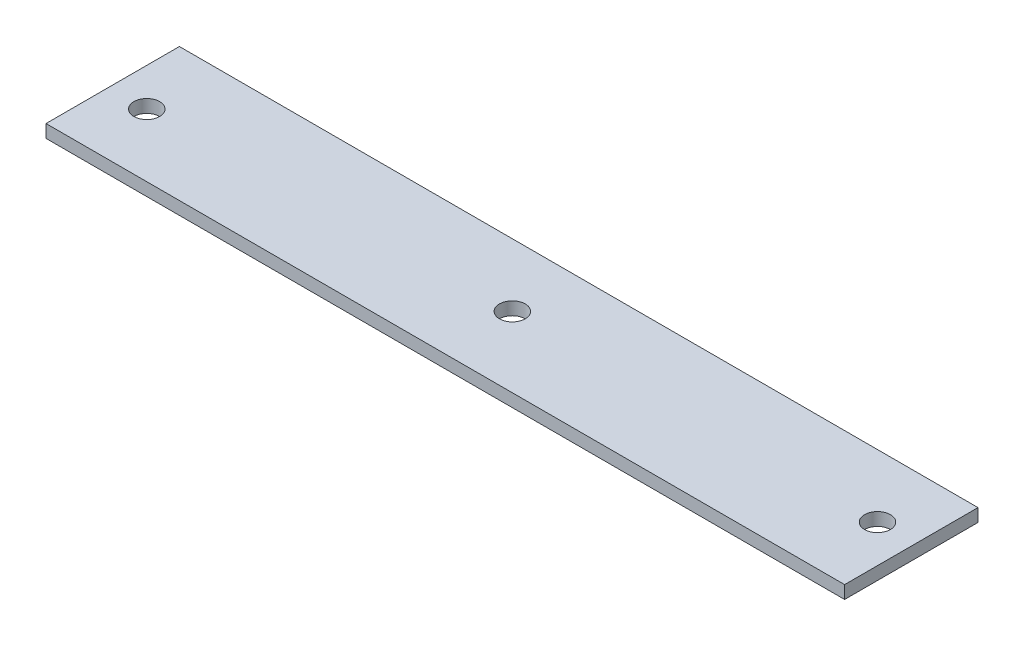
ISO-10303-21;
HEADER;
FILE_DESCRIPTION(('STEP AP214'),'2;1');
FILE_NAME('part.step','',(''),(''),'','','');
FILE_SCHEMA(('AUTOMOTIVE_DESIGN { 1 0 10303 214 1 1 1 1 }'));
ENDSEC;
DATA;
#1=APPLICATION_CONTEXT('core data for automotive mechanical design processes');
#2=APPLICATION_PROTOCOL_DEFINITION('international standard','automotive_design',2000,#1);
#3=PRODUCT_CONTEXT('',#1,'mechanical');
#4=PRODUCT('Part','Part','',(#3));
#5=PRODUCT_RELATED_PRODUCT_CATEGORY('part','',(#4));
#6=PRODUCT_DEFINITION_FORMATION('','',#4);
#7=PRODUCT_DEFINITION_CONTEXT('part definition',#1,'design');
#8=PRODUCT_DEFINITION('design','',#6,#7);
#9=PRODUCT_DEFINITION_SHAPE('','',#8);
#10=(LENGTH_UNIT() NAMED_UNIT(*) SI_UNIT(.MILLI.,.METRE.));
#11=(NAMED_UNIT(*) PLANE_ANGLE_UNIT() SI_UNIT($,.RADIAN.));
#12=(NAMED_UNIT(*) SI_UNIT($,.STERADIAN.) SOLID_ANGLE_UNIT());
#13=UNCERTAINTY_MEASURE_WITH_UNIT(LENGTH_MEASURE(1.E-05),#10,'distance_accuracy_value','');
#14=(GEOMETRIC_REPRESENTATION_CONTEXT(3) GLOBAL_UNCERTAINTY_ASSIGNED_CONTEXT((#13)) GLOBAL_UNIT_ASSIGNED_CONTEXT((#10,
#11,#12)) REPRESENTATION_CONTEXT('',''));
#15=CARTESIAN_POINT('',(0.,0.,0.));
#16=DIRECTION('',(0.,0.,1.));
#17=DIRECTION('',(1.,0.,0.));
#18=AXIS2_PLACEMENT_3D('',#15,#16,#17);
#19=CARTESIAN_POINT('',(0.,1.5,0.));
#20=DIRECTION('',(0.,1.,0.));
#21=DIRECTION('',(0.,0.,1.));
#22=AXIS2_PLACEMENT_3D('',#19,#20,#21);
#23=PLANE('',#22);
#24=CARTESIAN_POINT('',(-0.067979950948191,1.5,-0.719548896333341));
#25=DIRECTION('',(0.,1.,0.));
#26=DIRECTION('',(0.,0.,1.));
#27=AXIS2_PLACEMENT_3D('',#24,#25,#26);
#28=CIRCLE('',#27,1.5);
#29=CARTESIAN_POINT('',(-0.067979950948191,1.5,0.780451103666659));
#30=VERTEX_POINT('',#29);
#31=EDGE_CURVE('E117',#30,#30,#28,.T.);
#32=ORIENTED_EDGE('',*,*,#31,.F.);
#33=EDGE_LOOP('',(#32));
#34=FACE_BOUND('',#33,.T.);
#35=DIRECTION('',(0.,0.,1.));
#36=VECTOR('',#35,1.);
#37=CARTESIAN_POINT('',(-46.0679799509482,1.5,-8.02954889633334));
#38=LINE('',#37,#36);
#39=CARTESIAN_POINT('',(-46.0679799509482,1.5,-8.02954889633334));
#40=VERTEX_POINT('',#39);
#41=CARTESIAN_POINT('',(-46.0679799509482,1.5,7.47045110366666));
#42=VERTEX_POINT('',#41);
#43=EDGE_CURVE('E87',#40,#42,#38,.T.);
#44=ORIENTED_EDGE('',*,*,#43,.T.);
#45=DIRECTION('',(1.,0.,0.));
#46=VECTOR('',#45,1.);
#47=CARTESIAN_POINT('',(-46.0679799509482,1.5,7.47045110366666));
#48=LINE('',#47,#46);
#49=CARTESIAN_POINT('',(46.7320200490518,1.5,7.47045110366666));
#50=VERTEX_POINT('',#49);
#51=EDGE_CURVE('E82',#42,#50,#48,.T.);
#52=ORIENTED_EDGE('',*,*,#51,.T.);
#53=DIRECTION('',(0.,0.,-1.));
#54=VECTOR('',#53,1.);
#55=CARTESIAN_POINT('',(46.7320200490518,1.5,-8.02954889633334));
#56=LINE('',#55,#54);
#57=CARTESIAN_POINT('',(46.7320200490518,1.5,-8.02954889633334));
#58=VERTEX_POINT('',#57);
#59=EDGE_CURVE('E85',#50,#58,#56,.T.);
#60=ORIENTED_EDGE('',*,*,#59,.T.);
#61=DIRECTION('',(-1.,0.,0.));
#62=VECTOR('',#61,1.);
#63=CARTESIAN_POINT('',(-46.0679799509482,1.5,-8.02954889633334));
#64=LINE('',#63,#62);
#65=EDGE_CURVE('E52',#58,#40,#64,.T.);
#66=ORIENTED_EDGE('',*,*,#65,.T.);
#67=EDGE_LOOP('',(#44,#52,#60,#66));
#68=FACE_BOUND('',#67,.T.);
#69=CARTESIAN_POINT('',(-41.6679799509482,1.5,0.160451103666664));
#70=DIRECTION('',(0.,1.,0.));
#71=DIRECTION('',(0.,0.,1.));
#72=AXIS2_PLACEMENT_3D('',#69,#70,#71);
#73=CIRCLE('',#72,1.5);
#74=CARTESIAN_POINT('',(-41.6679799509482,1.5,1.66045110366667));
#75=VERTEX_POINT('',#74);
#76=EDGE_CURVE('E102',#75,#75,#73,.T.);
#77=ORIENTED_EDGE('',*,*,#76,.F.);
#78=EDGE_LOOP('',(#77));
#79=FACE_BOUND('',#78,.T.);
#80=CARTESIAN_POINT('',(42.3520200490518,1.5,-0.729548896333337));
#81=DIRECTION('',(0.,1.,0.));
#82=DIRECTION('',(0.,0.,1.));
#83=AXIS2_PLACEMENT_3D('',#80,#81,#82);
#84=CIRCLE('',#83,1.5);
#85=CARTESIAN_POINT('',(42.3520200490518,1.5,0.770451103666666));
#86=VERTEX_POINT('',#85);
#87=EDGE_CURVE('E123',#86,#86,#84,.T.);
#88=ORIENTED_EDGE('',*,*,#87,.F.);
#89=EDGE_LOOP('',(#88));
#90=FACE_BOUND('',#89,.T.);
#91=ADVANCED_FACE('F35',(#34,#68,#79,#90),#23,.T.);
#92=CARTESIAN_POINT('',(0.,0.,0.));
#93=DIRECTION('',(0.,1.,0.));
#94=DIRECTION('',(0.,0.,1.));
#95=AXIS2_PLACEMENT_3D('',#92,#93,#94);
#96=PLANE('',#95);
#97=DIRECTION('',(0.,0.,1.));
#98=VECTOR('',#97,1.);
#99=CARTESIAN_POINT('',(-46.0679799509482,0.,-8.02954889633334));
#100=LINE('',#99,#98);
#101=CARTESIAN_POINT('',(-46.0679799509482,0.,-8.02954889633334));
#102=VERTEX_POINT('',#101);
#103=CARTESIAN_POINT('',(-46.0679799509482,0.,7.47045110366666));
#104=VERTEX_POINT('',#103);
#105=EDGE_CURVE('E99',#102,#104,#100,.T.);
#106=ORIENTED_EDGE('',*,*,#105,.F.);
#107=DIRECTION('',(-1.,0.,0.));
#108=VECTOR('',#107,1.);
#109=CARTESIAN_POINT('',(-46.0679799509482,0.,-8.02954889633334));
#110=LINE('',#109,#108);
#111=CARTESIAN_POINT('',(46.7320200490518,0.,-8.02954889633334));
#112=VERTEX_POINT('',#111);
#113=EDGE_CURVE('E75',#112,#102,#110,.T.);
#114=ORIENTED_EDGE('',*,*,#113,.F.);
#115=DIRECTION('',(0.,0.,-1.));
#116=VECTOR('',#115,1.);
#117=CARTESIAN_POINT('',(46.7320200490518,0.,-8.02954889633334));
#118=LINE('',#117,#116);
#119=CARTESIAN_POINT('',(46.7320200490518,0.,7.47045110366666));
#120=VERTEX_POINT('',#119);
#121=EDGE_CURVE('E69',#120,#112,#118,.T.);
#122=ORIENTED_EDGE('',*,*,#121,.F.);
#123=DIRECTION('',(1.,0.,0.));
#124=VECTOR('',#123,1.);
#125=CARTESIAN_POINT('',(-46.0679799509482,0.,7.47045110366666));
#126=LINE('',#125,#124);
#127=EDGE_CURVE('E91',#104,#120,#126,.T.);
#128=ORIENTED_EDGE('',*,*,#127,.F.);
#129=EDGE_LOOP('',(#106,#114,#122,#128));
#130=FACE_BOUND('',#129,.T.);
#131=CARTESIAN_POINT('',(-41.6679799509482,0.,0.160451103666664));
#132=DIRECTION('',(0.,1.,0.));
#133=DIRECTION('',(0.,0.,1.));
#134=AXIS2_PLACEMENT_3D('',#131,#132,#133);
#135=CIRCLE('',#134,1.5);
#136=CARTESIAN_POINT('',(-41.6679799509482,0.,1.66045110366667));
#137=VERTEX_POINT('',#136);
#138=EDGE_CURVE('E114',#137,#137,#135,.T.);
#139=ORIENTED_EDGE('',*,*,#138,.T.);
#140=EDGE_LOOP('',(#139));
#141=FACE_BOUND('',#140,.T.);
#142=CARTESIAN_POINT('',(-0.067979950948191,0.,-0.719548896333341));
#143=DIRECTION('',(0.,1.,0.));
#144=DIRECTION('',(0.,0.,1.));
#145=AXIS2_PLACEMENT_3D('',#142,#143,#144);
#146=CIRCLE('',#145,1.5);
#147=CARTESIAN_POINT('',(-0.067979950948191,0.,0.780451103666659));
#148=VERTEX_POINT('',#147);
#149=EDGE_CURVE('E120',#148,#148,#146,.T.);
#150=ORIENTED_EDGE('',*,*,#149,.T.);
#151=EDGE_LOOP('',(#150));
#152=FACE_BOUND('',#151,.T.);
#153=CARTESIAN_POINT('',(42.3520200490518,0.,-0.729548896333337));
#154=DIRECTION('',(0.,1.,0.));
#155=DIRECTION('',(0.,0.,1.));
#156=AXIS2_PLACEMENT_3D('',#153,#154,#155);
#157=CIRCLE('',#156,1.5);
#158=CARTESIAN_POINT('',(42.3520200490518,0.,0.770451103666666));
#159=VERTEX_POINT('',#158);
#160=EDGE_CURVE('E126',#159,#159,#157,.T.);
#161=ORIENTED_EDGE('',*,*,#160,.T.);
#162=EDGE_LOOP('',(#161));
#163=FACE_BOUND('',#162,.T.);
#164=ADVANCED_FACE('F110',(#130,#141,#152,#163),#96,.F.);
#165=CARTESIAN_POINT('',(-46.0679799509482,1.5,-8.02954889633334));
#166=DIRECTION('',(1.,0.,0.));
#167=DIRECTION('',(0.,0.,-1.));
#168=AXIS2_PLACEMENT_3D('',#165,#166,#167);
#169=PLANE('',#168);
#170=ORIENTED_EDGE('',*,*,#105,.T.);
#171=DIRECTION('',(0.,-1.,0.));
#172=VECTOR('',#171,1.);
#173=CARTESIAN_POINT('',(-46.0679799509482,1.5,7.47045110366666));
#174=LINE('',#173,#172);
#175=EDGE_CURVE('E11',#42,#104,#174,.T.);
#176=ORIENTED_EDGE('',*,*,#175,.F.);
#177=ORIENTED_EDGE('',*,*,#43,.F.);
#178=DIRECTION('',(0.,-1.,0.));
#179=VECTOR('',#178,1.);
#180=CARTESIAN_POINT('',(-46.0679799509482,1.5,-8.02954889633334));
#181=LINE('',#180,#179);
#182=EDGE_CURVE('E95',#40,#102,#181,.T.);
#183=ORIENTED_EDGE('',*,*,#182,.T.);
#184=EDGE_LOOP('',(#170,#176,#177,#183));
#185=FACE_BOUND('',#184,.T.);
#186=ADVANCED_FACE('F37',(#185),#169,.F.);
#187=CARTESIAN_POINT('',(-46.0679799509482,1.5,7.47045110366666));
#188=DIRECTION('',(0.,0.,-1.));
#189=DIRECTION('',(-1.,0.,0.));
#190=AXIS2_PLACEMENT_3D('',#187,#188,#189);
#191=PLANE('',#190);
#192=ORIENTED_EDGE('',*,*,#127,.T.);
#193=DIRECTION('',(0.,-1.,0.));
#194=VECTOR('',#193,1.);
#195=CARTESIAN_POINT('',(46.7320200490518,1.5,7.47045110366666));
#196=LINE('',#195,#194);
#197=EDGE_CURVE('E44',#50,#120,#196,.T.);
#198=ORIENTED_EDGE('',*,*,#197,.F.);
#199=ORIENTED_EDGE('',*,*,#51,.F.);
#200=ORIENTED_EDGE('',*,*,#175,.T.);
#201=EDGE_LOOP('',(#192,#198,#199,#200));
#202=FACE_BOUND('',#201,.T.);
#203=ADVANCED_FACE('F90',(#202),#191,.F.);
#204=CARTESIAN_POINT('',(46.7320200490518,1.5,-8.02954889633334));
#205=DIRECTION('',(-1.,0.,0.));
#206=DIRECTION('',(0.,0.,1.));
#207=AXIS2_PLACEMENT_3D('',#204,#205,#206);
#208=PLANE('',#207);
#209=ORIENTED_EDGE('',*,*,#121,.T.);
#210=DIRECTION('',(0.,-1.,0.));
#211=VECTOR('',#210,1.);
#212=CARTESIAN_POINT('',(46.7320200490518,1.5,-8.02954889633334));
#213=LINE('',#212,#211);
#214=EDGE_CURVE('E92',#58,#112,#213,.T.);
#215=ORIENTED_EDGE('',*,*,#214,.F.);
#216=ORIENTED_EDGE('',*,*,#59,.F.);
#217=ORIENTED_EDGE('',*,*,#197,.T.);
#218=EDGE_LOOP('',(#209,#215,#216,#217));
#219=FACE_BOUND('',#218,.T.);
#220=ADVANCED_FACE('F93',(#219),#208,.F.);
#221=CARTESIAN_POINT('',(-46.0679799509482,1.5,-8.02954889633334));
#222=DIRECTION('',(0.,0.,1.));
#223=DIRECTION('',(1.,0.,0.));
#224=AXIS2_PLACEMENT_3D('',#221,#222,#223);
#225=PLANE('',#224);
#226=ORIENTED_EDGE('',*,*,#113,.T.);
#227=ORIENTED_EDGE('',*,*,#182,.F.);
#228=ORIENTED_EDGE('',*,*,#65,.F.);
#229=ORIENTED_EDGE('',*,*,#214,.T.);
#230=EDGE_LOOP('',(#226,#227,#228,#229));
#231=FACE_BOUND('',#230,.T.);
#232=ADVANCED_FACE('F107',(#231),#225,.F.);
#233=CARTESIAN_POINT('',(-41.6679799509482,1.5,0.160451103666664));
#234=DIRECTION('',(0.,-1.,0.));
#235=DIRECTION('',(0.,0.,-1.));
#236=AXIS2_PLACEMENT_3D('',#233,#234,#235);
#237=CYLINDRICAL_SURFACE('',#236,1.5);
#238=ORIENTED_EDGE('',*,*,#76,.T.);
#239=EDGE_LOOP('',(#238));
#240=FACE_BOUND('',#239,.T.);
#241=ORIENTED_EDGE('',*,*,#138,.F.);
#242=EDGE_LOOP('',(#241));
#243=FACE_BOUND('',#242,.T.);
#244=ADVANCED_FACE('F144',(#240,#243),#237,.F.);
#245=CARTESIAN_POINT('',(-0.067979950948191,1.5,-0.719548896333341));
#246=DIRECTION('',(0.,-1.,0.));
#247=DIRECTION('',(0.,0.,-1.));
#248=AXIS2_PLACEMENT_3D('',#245,#246,#247);
#249=CYLINDRICAL_SURFACE('',#248,1.5);
#250=ORIENTED_EDGE('',*,*,#31,.T.);
#251=EDGE_LOOP('',(#250));
#252=FACE_BOUND('',#251,.T.);
#253=ORIENTED_EDGE('',*,*,#149,.F.);
#254=EDGE_LOOP('',(#253));
#255=FACE_BOUND('',#254,.T.);
#256=ADVANCED_FACE('F190',(#252,#255),#249,.F.);
#257=CARTESIAN_POINT('',(42.3520200490518,1.5,-0.729548896333337));
#258=DIRECTION('',(0.,-1.,0.));
#259=DIRECTION('',(0.,0.,-1.));
#260=AXIS2_PLACEMENT_3D('',#257,#258,#259);
#261=CYLINDRICAL_SURFACE('',#260,1.5);
#262=ORIENTED_EDGE('',*,*,#87,.T.);
#263=EDGE_LOOP('',(#262));
#264=FACE_BOUND('',#263,.T.);
#265=ORIENTED_EDGE('',*,*,#160,.F.);
#266=EDGE_LOOP('',(#265));
#267=FACE_BOUND('',#266,.T.);
#268=ADVANCED_FACE('F132',(#264,#267),#261,.F.);
#269=CLOSED_SHELL('',(#91,#164,#186,#203,#220,#232,#244,#256,#268));
#270=MANIFOLD_SOLID_BREP('B2',#269);
#271=ADVANCED_BREP_SHAPE_REPRESENTATION('',(#18,#270),#14);
#272=SHAPE_DEFINITION_REPRESENTATION(#9,#271);
ENDSEC;
END-ISO-10303-21;
